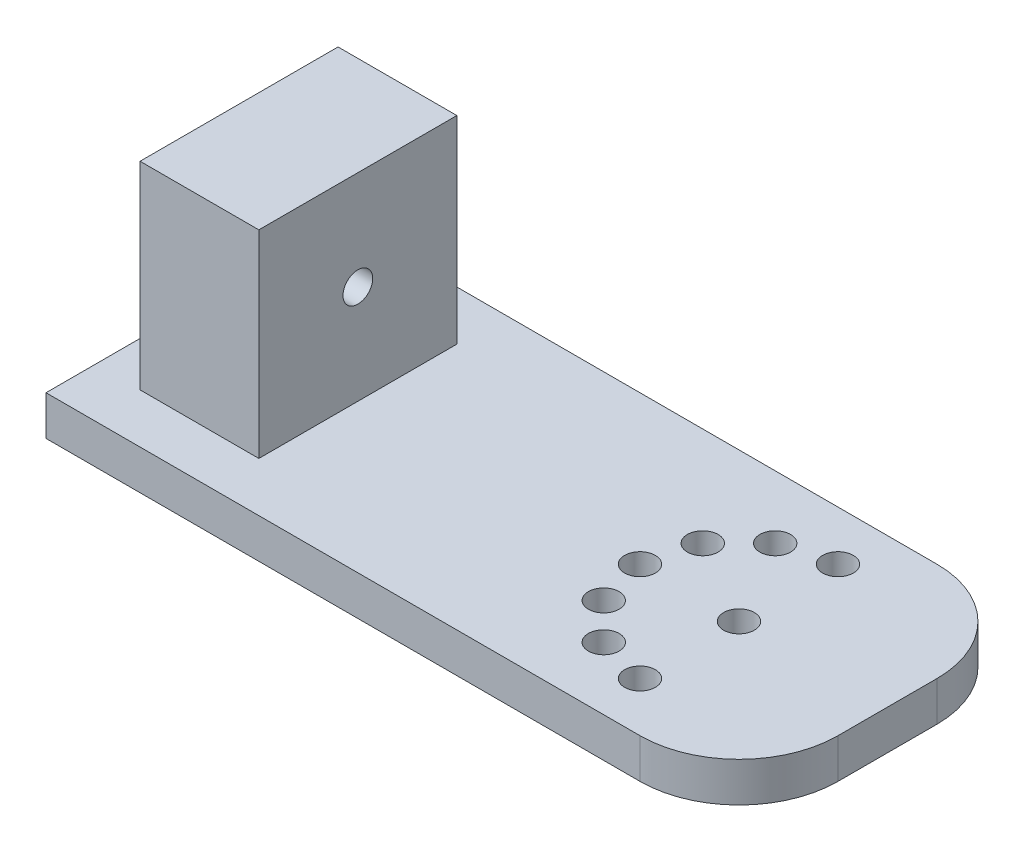
ISO-10303-21;
HEADER;
FILE_DESCRIPTION(('STEP AP214'),'2;1');
FILE_NAME('part.step','',(''),(''),'','','');
FILE_SCHEMA(('AUTOMOTIVE_DESIGN { 1 0 10303 214 1 1 1 1 }'));
ENDSEC;
DATA;
#1=APPLICATION_CONTEXT('core data for automotive mechanical design processes');
#2=APPLICATION_PROTOCOL_DEFINITION('international standard','automotive_design',2000,#1);
#3=PRODUCT_CONTEXT('',#1,'mechanical');
#4=PRODUCT('Part','Part','',(#3));
#5=PRODUCT_RELATED_PRODUCT_CATEGORY('part','',(#4));
#6=PRODUCT_DEFINITION_FORMATION('','',#4);
#7=PRODUCT_DEFINITION_CONTEXT('part definition',#1,'design');
#8=PRODUCT_DEFINITION('design','',#6,#7);
#9=PRODUCT_DEFINITION_SHAPE('','',#8);
#10=(LENGTH_UNIT() NAMED_UNIT(*) SI_UNIT(.MILLI.,.METRE.));
#11=(NAMED_UNIT(*) PLANE_ANGLE_UNIT() SI_UNIT($,.RADIAN.));
#12=(NAMED_UNIT(*) SI_UNIT($,.STERADIAN.) SOLID_ANGLE_UNIT());
#13=UNCERTAINTY_MEASURE_WITH_UNIT(LENGTH_MEASURE(1.E-05),#10,'distance_accuracy_value','');
#14=(GEOMETRIC_REPRESENTATION_CONTEXT(3) GLOBAL_UNCERTAINTY_ASSIGNED_CONTEXT((#13)) GLOBAL_UNIT_ASSIGNED_CONTEXT((#10,
#11,#12)) REPRESENTATION_CONTEXT('',''));
#15=CARTESIAN_POINT('',(0.,0.,0.));
#16=DIRECTION('',(0.,0.,1.));
#17=DIRECTION('',(1.,0.,0.));
#18=AXIS2_PLACEMENT_3D('',#15,#16,#17);
#19=CARTESIAN_POINT('',(60.,4.,10.));
#20=DIRECTION('',(0.,-1.,0.));
#21=DIRECTION('',(0.,0.,-1.));
#22=AXIS2_PLACEMENT_3D('',#19,#20,#21);
#23=CYLINDRICAL_SURFACE('',#22,10.);
#24=DIRECTION('',(0.,-1.,0.));
#25=VECTOR('',#24,1.);
#26=CARTESIAN_POINT('',(60.,4.,0.));
#27=LINE('',#26,#25);
#28=CARTESIAN_POINT('',(60.,4.,0.));
#29=VERTEX_POINT('',#28);
#30=CARTESIAN_POINT('',(60.,0.,0.));
#31=VERTEX_POINT('',#30);
#32=EDGE_CURVE('E202',#29,#31,#27,.T.);
#33=ORIENTED_EDGE('',*,*,#32,.F.);
#34=CARTESIAN_POINT('',(60.,4.,10.));
#35=DIRECTION('',(0.,1.,0.));
#36=DIRECTION('',(0.,0.,1.));
#37=AXIS2_PLACEMENT_3D('',#34,#35,#36);
#38=CIRCLE('',#37,10.);
#39=CARTESIAN_POINT('',(70.,4.,10.));
#40=VERTEX_POINT('',#39);
#41=EDGE_CURVE('E41',#40,#29,#38,.T.);
#42=ORIENTED_EDGE('',*,*,#41,.F.);
#43=DIRECTION('',(0.,-1.,0.));
#44=VECTOR('',#43,1.);
#45=CARTESIAN_POINT('',(70.,4.,10.));
#46=LINE('',#45,#44);
#47=CARTESIAN_POINT('',(70.,0.,10.));
#48=VERTEX_POINT('',#47);
#49=EDGE_CURVE('E205',#48,#40,#46,.F.);
#50=ORIENTED_EDGE('',*,*,#49,.F.);
#51=CARTESIAN_POINT('',(60.,0.,10.));
#52=DIRECTION('',(0.,1.,0.));
#53=DIRECTION('',(0.,0.,1.));
#54=AXIS2_PLACEMENT_3D('',#51,#52,#53);
#55=CIRCLE('',#54,10.);
#56=EDGE_CURVE('E11',#31,#48,#55,.F.);
#57=ORIENTED_EDGE('',*,*,#56,.F.);
#58=EDGE_LOOP('',(#33,#42,#50,#57));
#59=FACE_BOUND('',#58,.T.);
#60=ADVANCED_FACE('F34',(#59),#23,.T.);
#61=CARTESIAN_POINT('',(60.,4.,20.));
#62=DIRECTION('',(0.,1.,0.));
#63=DIRECTION('',(0.,0.,1.));
#64=AXIS2_PLACEMENT_3D('',#61,#62,#63);
#65=CYLINDRICAL_SURFACE('',#64,10.);
#66=DIRECTION('',(0.,1.,0.));
#67=VECTOR('',#66,1.);
#68=CARTESIAN_POINT('',(60.,4.,30.));
#69=LINE('',#68,#67);
#70=CARTESIAN_POINT('',(60.,0.,30.));
#71=VERTEX_POINT('',#70);
#72=CARTESIAN_POINT('',(60.,4.,30.));
#73=VERTEX_POINT('',#72);
#74=EDGE_CURVE('E166',#71,#73,#69,.T.);
#75=ORIENTED_EDGE('',*,*,#74,.F.);
#76=CARTESIAN_POINT('',(60.,0.,20.));
#77=DIRECTION('',(0.,1.,0.));
#78=DIRECTION('',(0.,0.,1.));
#79=AXIS2_PLACEMENT_3D('',#76,#77,#78);
#80=CIRCLE('',#79,10.);
#81=CARTESIAN_POINT('',(70.,0.,20.));
#82=VERTEX_POINT('',#81);
#83=EDGE_CURVE('E198',#82,#71,#80,.F.);
#84=ORIENTED_EDGE('',*,*,#83,.F.);
#85=DIRECTION('',(0.,1.,0.));
#86=VECTOR('',#85,1.);
#87=CARTESIAN_POINT('',(70.,4.,20.));
#88=LINE('',#87,#86);
#89=CARTESIAN_POINT('',(70.,4.,20.));
#90=VERTEX_POINT('',#89);
#91=EDGE_CURVE('E195',#90,#82,#88,.F.);
#92=ORIENTED_EDGE('',*,*,#91,.F.);
#93=CARTESIAN_POINT('',(60.,4.,20.));
#94=DIRECTION('',(0.,1.,0.));
#95=DIRECTION('',(0.,0.,1.));
#96=AXIS2_PLACEMENT_3D('',#93,#94,#95);
#97=CIRCLE('',#96,10.);
#98=EDGE_CURVE('E200',#73,#90,#97,.T.);
#99=ORIENTED_EDGE('',*,*,#98,.F.);
#100=EDGE_LOOP('',(#75,#84,#92,#99));
#101=FACE_BOUND('',#100,.T.);
#102=ADVANCED_FACE('F224',(#101),#65,.T.);
#103=CARTESIAN_POINT('',(0.,4.,0.));
#104=DIRECTION('',(0.,1.,0.));
#105=DIRECTION('',(0.,0.,1.));
#106=AXIS2_PLACEMENT_3D('',#103,#104,#105);
#107=PLANE('',#106);
#108=CARTESIAN_POINT('',(55.,4.,5.));
#109=DIRECTION('',(0.,1.,0.));
#110=DIRECTION('',(0.,0.,1.));
#111=AXIS2_PLACEMENT_3D('',#108,#109,#110);
#112=CIRCLE('',#111,1.55);
#113=CARTESIAN_POINT('',(55.,4.,6.55));
#114=VERTEX_POINT('',#113);
#115=EDGE_CURVE('E431',#114,#114,#112,.T.);
#116=ORIENTED_EDGE('',*,*,#115,.F.);
#117=EDGE_LOOP('',(#116));
#118=FACE_BOUND('',#117,.T.);
#119=CARTESIAN_POINT('',(45.,4.,15.));
#120=DIRECTION('',(0.,1.,0.));
#121=DIRECTION('',(0.,0.,1.));
#122=AXIS2_PLACEMENT_3D('',#119,#120,#121);
#123=CIRCLE('',#122,1.55);
#124=CARTESIAN_POINT('',(45.,4.,16.55));
#125=VERTEX_POINT('',#124);
#126=EDGE_CURVE('E433',#125,#125,#123,.T.);
#127=ORIENTED_EDGE('',*,*,#126,.F.);
#128=EDGE_LOOP('',(#127));
#129=FACE_BOUND('',#128,.T.);
#130=CARTESIAN_POINT('',(55.,4.,25.));
#131=DIRECTION('',(0.,1.,0.));
#132=DIRECTION('',(0.,0.,1.));
#133=AXIS2_PLACEMENT_3D('',#130,#131,#132);
#134=CIRCLE('',#133,1.55);
#135=CARTESIAN_POINT('',(55.,4.,26.55));
#136=VERTEX_POINT('',#135);
#137=EDGE_CURVE('E438',#136,#136,#134,.T.);
#138=ORIENTED_EDGE('',*,*,#137,.F.);
#139=EDGE_LOOP('',(#138));
#140=FACE_BOUND('',#139,.T.);
#141=CARTESIAN_POINT('',(49.9999999999998,4.,23.6602540378443));
#142=DIRECTION('',(0.,1.,0.));
#143=DIRECTION('',(0.,0.,-1.));
#144=AXIS2_PLACEMENT_3D('',#141,#142,#143);
#145=CIRCLE('',#144,1.55000000000001);
#146=CARTESIAN_POINT('',(49.9999999999998,4.,22.1102540378442));
#147=VERTEX_POINT('',#146);
#148=EDGE_CURVE('E446',#147,#147,#145,.T.);
#149=ORIENTED_EDGE('',*,*,#148,.F.);
#150=EDGE_LOOP('',(#149));
#151=FACE_BOUND('',#150,.T.);
#152=CARTESIAN_POINT('',(46.3397459621556,4.,20.));
#153=DIRECTION('',(0.,1.,0.));
#154=DIRECTION('',(0.,0.,-1.));
#155=AXIS2_PLACEMENT_3D('',#152,#153,#154);
#156=CIRCLE('',#155,1.54999999999999);
#157=CARTESIAN_POINT('',(46.3397459621556,4.,18.45));
#158=VERTEX_POINT('',#157);
#159=EDGE_CURVE('E448',#158,#158,#156,.T.);
#160=ORIENTED_EDGE('',*,*,#159,.F.);
#161=EDGE_LOOP('',(#160));
#162=FACE_BOUND('',#161,.T.);
#163=CARTESIAN_POINT('',(46.3397459621556,4.,9.99999999999996));
#164=DIRECTION('',(0.,1.,0.));
#165=DIRECTION('',(0.,0.,-1.));
#166=AXIS2_PLACEMENT_3D('',#163,#164,#165);
#167=CIRCLE('',#166,1.55000000000001);
#168=CARTESIAN_POINT('',(46.3397459621556,4.,8.44999999999996));
#169=VERTEX_POINT('',#168);
#170=EDGE_CURVE('E474',#169,#169,#167,.T.);
#171=ORIENTED_EDGE('',*,*,#170,.F.);
#172=EDGE_LOOP('',(#171));
#173=FACE_BOUND('',#172,.T.);
#174=CARTESIAN_POINT('',(50.0000000000001,4.,6.33974596215558));
#175=DIRECTION('',(0.,1.,0.));
#176=DIRECTION('',(0.,0.,-1.));
#177=AXIS2_PLACEMENT_3D('',#174,#175,#176);
#178=CIRCLE('',#177,1.55);
#179=CARTESIAN_POINT('',(50.0000000000001,4.,4.78974596215558));
#180=VERTEX_POINT('',#179);
#181=EDGE_CURVE('E441',#180,#180,#178,.T.);
#182=ORIENTED_EDGE('',*,*,#181,.F.);
#183=EDGE_LOOP('',(#182));
#184=FACE_BOUND('',#183,.T.);
#185=CARTESIAN_POINT('',(55.,4.,15.));
#186=DIRECTION('',(0.,1.,0.));
#187=DIRECTION('',(0.,0.,1.));
#188=AXIS2_PLACEMENT_3D('',#185,#186,#187);
#189=CIRCLE('',#188,1.55);
#190=CARTESIAN_POINT('',(55.,4.,16.55));
#191=VERTEX_POINT('',#190);
#192=EDGE_CURVE('E171',#191,#191,#189,.T.);
#193=ORIENTED_EDGE('',*,*,#192,.F.);
#194=EDGE_LOOP('',(#193));
#195=FACE_BOUND('',#194,.T.);
#196=DIRECTION('',(0.,0.,-1.));
#197=VECTOR('',#196,1.);
#198=CARTESIAN_POINT('',(70.,4.,0.));
#199=LINE('',#198,#197);
#200=EDGE_CURVE('E149',#90,#40,#199,.T.);
#201=ORIENTED_EDGE('',*,*,#200,.T.);
#202=ORIENTED_EDGE('',*,*,#41,.T.);
#203=DIRECTION('',(-1.,0.,0.));
#204=VECTOR('',#203,1.);
#205=CARTESIAN_POINT('',(0.,4.,0.));
#206=LINE('',#205,#204);
#207=CARTESIAN_POINT('',(0.,4.,0.));
#208=VERTEX_POINT('',#207);
#209=EDGE_CURVE('E152',#29,#208,#206,.T.);
#210=ORIENTED_EDGE('',*,*,#209,.T.);
#211=DIRECTION('',(0.,0.,1.));
#212=VECTOR('',#211,1.);
#213=CARTESIAN_POINT('',(0.,4.,0.));
#214=LINE('',#213,#212);
#215=CARTESIAN_POINT('',(0.,4.,30.));
#216=VERTEX_POINT('',#215);
#217=EDGE_CURVE('E142',#208,#216,#214,.T.);
#218=ORIENTED_EDGE('',*,*,#217,.T.);
#219=DIRECTION('',(1.,0.,0.));
#220=VECTOR('',#219,1.);
#221=CARTESIAN_POINT('',(0.,4.,30.));
#222=LINE('',#221,#220);
#223=EDGE_CURVE('E145',#216,#73,#222,.T.);
#224=ORIENTED_EDGE('',*,*,#223,.T.);
#225=ORIENTED_EDGE('',*,*,#98,.T.);
#226=EDGE_LOOP('',(#201,#202,#210,#218,#224,#225));
#227=FACE_BOUND('',#226,.T.);
#228=DIRECTION('',(1.,0.,0.));
#229=VECTOR('',#228,1.);
#230=CARTESIAN_POINT('',(4.5,4.,25.));
#231=LINE('',#230,#229);
#232=CARTESIAN_POINT('',(4.5,4.,25.));
#233=VERTEX_POINT('',#232);
#234=CARTESIAN_POINT('',(16.5,4.,25.));
#235=VERTEX_POINT('',#234);
#236=EDGE_CURVE('E459',#233,#235,#231,.T.);
#237=ORIENTED_EDGE('',*,*,#236,.F.);
#238=DIRECTION('',(0.,0.,1.));
#239=VECTOR('',#238,1.);
#240=CARTESIAN_POINT('',(4.5,4.,5.));
#241=LINE('',#240,#239);
#242=CARTESIAN_POINT('',(4.5,4.,5.));
#243=VERTEX_POINT('',#242);
#244=EDGE_CURVE('E131',#243,#233,#241,.T.);
#245=ORIENTED_EDGE('',*,*,#244,.F.);
#246=DIRECTION('',(-1.,0.,0.));
#247=VECTOR('',#246,1.);
#248=CARTESIAN_POINT('',(4.5,4.,5.));
#249=LINE('',#248,#247);
#250=CARTESIAN_POINT('',(16.5,4.,5.));
#251=VERTEX_POINT('',#250);
#252=EDGE_CURVE('E127',#251,#243,#249,.T.);
#253=ORIENTED_EDGE('',*,*,#252,.F.);
#254=DIRECTION('',(0.,0.,-1.));
#255=VECTOR('',#254,1.);
#256=CARTESIAN_POINT('',(16.5,4.,5.));
#257=LINE('',#256,#255);
#258=EDGE_CURVE('E461',#235,#251,#257,.T.);
#259=ORIENTED_EDGE('',*,*,#258,.F.);
#260=EDGE_LOOP('',(#237,#245,#253,#259));
#261=FACE_BOUND('',#260,.T.);
#262=ADVANCED_FACE('F207',(#118,#129,#140,#151,#162,#173,#184,#195,#227,#261),#107,.T.);
#263=CARTESIAN_POINT('',(0.,4.,0.));
#264=DIRECTION('',(1.,0.,0.));
#265=DIRECTION('',(0.,0.,-1.));
#266=AXIS2_PLACEMENT_3D('',#263,#264,#265);
#267=PLANE('',#266);
#268=DIRECTION('',(0.,0.,1.));
#269=VECTOR('',#268,1.);
#270=CARTESIAN_POINT('',(0.,0.,0.));
#271=LINE('',#270,#269);
#272=CARTESIAN_POINT('',(0.,0.,0.));
#273=VERTEX_POINT('',#272);
#274=CARTESIAN_POINT('',(0.,0.,30.));
#275=VERTEX_POINT('',#274);
#276=EDGE_CURVE('E133',#273,#275,#271,.T.);
#277=ORIENTED_EDGE('',*,*,#276,.T.);
#278=DIRECTION('',(0.,-1.,0.));
#279=VECTOR('',#278,1.);
#280=CARTESIAN_POINT('',(0.,4.,30.));
#281=LINE('',#280,#279);
#282=EDGE_CURVE('E163',#216,#275,#281,.T.);
#283=ORIENTED_EDGE('',*,*,#282,.F.);
#284=ORIENTED_EDGE('',*,*,#217,.F.);
#285=DIRECTION('',(0.,-1.,0.));
#286=VECTOR('',#285,1.);
#287=CARTESIAN_POINT('',(0.,4.,0.));
#288=LINE('',#287,#286);
#289=EDGE_CURVE('E153',#208,#273,#288,.T.);
#290=ORIENTED_EDGE('',*,*,#289,.T.);
#291=EDGE_LOOP('',(#277,#283,#284,#290));
#292=FACE_BOUND('',#291,.T.);
#293=ADVANCED_FACE('F218',(#292),#267,.F.);
#294=CARTESIAN_POINT('',(0.,4.,30.));
#295=DIRECTION('',(0.,0.,-1.));
#296=DIRECTION('',(-1.,0.,0.));
#297=AXIS2_PLACEMENT_3D('',#294,#295,#296);
#298=PLANE('',#297);
#299=DIRECTION('',(1.,0.,0.));
#300=VECTOR('',#299,1.);
#301=CARTESIAN_POINT('',(0.,0.,30.));
#302=LINE('',#301,#300);
#303=EDGE_CURVE('E136',#275,#71,#302,.T.);
#304=ORIENTED_EDGE('',*,*,#303,.T.);
#305=ORIENTED_EDGE('',*,*,#74,.T.);
#306=ORIENTED_EDGE('',*,*,#223,.F.);
#307=ORIENTED_EDGE('',*,*,#282,.T.);
#308=EDGE_LOOP('',(#304,#305,#306,#307));
#309=FACE_BOUND('',#308,.T.);
#310=ADVANCED_FACE('F221',(#309),#298,.F.);
#311=CARTESIAN_POINT('',(70.,4.,0.));
#312=DIRECTION('',(-1.,0.,0.));
#313=DIRECTION('',(0.,0.,1.));
#314=AXIS2_PLACEMENT_3D('',#311,#312,#313);
#315=PLANE('',#314);
#316=DIRECTION('',(0.,0.,-1.));
#317=VECTOR('',#316,1.);
#318=CARTESIAN_POINT('',(70.,0.,0.));
#319=LINE('',#318,#317);
#320=EDGE_CURVE('E157',#82,#48,#319,.T.);
#321=ORIENTED_EDGE('',*,*,#320,.T.);
#322=ORIENTED_EDGE('',*,*,#49,.T.);
#323=ORIENTED_EDGE('',*,*,#200,.F.);
#324=ORIENTED_EDGE('',*,*,#91,.T.);
#325=EDGE_LOOP('',(#321,#322,#323,#324));
#326=FACE_BOUND('',#325,.T.);
#327=ADVANCED_FACE('F226',(#326),#315,.F.);
#328=CARTESIAN_POINT('',(0.,4.,0.));
#329=DIRECTION('',(0.,0.,1.));
#330=DIRECTION('',(1.,0.,0.));
#331=AXIS2_PLACEMENT_3D('',#328,#329,#330);
#332=PLANE('',#331);
#333=ORIENTED_EDGE('',*,*,#209,.F.);
#334=ORIENTED_EDGE('',*,*,#32,.T.);
#335=DIRECTION('',(-1.,0.,0.));
#336=VECTOR('',#335,1.);
#337=CARTESIAN_POINT('',(0.,0.,0.));
#338=LINE('',#337,#336);
#339=EDGE_CURVE('E146',#31,#273,#338,.T.);
#340=ORIENTED_EDGE('',*,*,#339,.T.);
#341=ORIENTED_EDGE('',*,*,#289,.F.);
#342=EDGE_LOOP('',(#333,#334,#340,#341));
#343=FACE_BOUND('',#342,.T.);
#344=ADVANCED_FACE('F213',(#343),#332,.F.);
#345=CARTESIAN_POINT('',(0.,0.,0.));
#346=DIRECTION('',(0.,1.,0.));
#347=DIRECTION('',(0.,0.,1.));
#348=AXIS2_PLACEMENT_3D('',#345,#346,#347);
#349=PLANE('',#348);
#350=CARTESIAN_POINT('',(55.,0.,5.));
#351=DIRECTION('',(0.,1.,0.));
#352=DIRECTION('',(0.,0.,1.));
#353=AXIS2_PLACEMENT_3D('',#350,#351,#352);
#354=CIRCLE('',#353,1.55);
#355=CARTESIAN_POINT('',(55.,0.,6.55));
#356=VERTEX_POINT('',#355);
#357=EDGE_CURVE('E189',#356,#356,#354,.T.);
#358=ORIENTED_EDGE('',*,*,#357,.T.);
#359=EDGE_LOOP('',(#358));
#360=FACE_BOUND('',#359,.T.);
#361=CARTESIAN_POINT('',(45.,0.,15.));
#362=DIRECTION('',(0.,1.,0.));
#363=DIRECTION('',(0.,0.,1.));
#364=AXIS2_PLACEMENT_3D('',#361,#362,#363);
#365=CIRCLE('',#364,1.55);
#366=CARTESIAN_POINT('',(45.,0.,16.55));
#367=VERTEX_POINT('',#366);
#368=EDGE_CURVE('E186',#367,#367,#365,.T.);
#369=ORIENTED_EDGE('',*,*,#368,.T.);
#370=EDGE_LOOP('',(#369));
#371=FACE_BOUND('',#370,.T.);
#372=CARTESIAN_POINT('',(55.,0.,25.));
#373=DIRECTION('',(0.,1.,0.));
#374=DIRECTION('',(0.,0.,1.));
#375=AXIS2_PLACEMENT_3D('',#372,#373,#374);
#376=CIRCLE('',#375,1.55);
#377=CARTESIAN_POINT('',(55.,0.,26.55));
#378=VERTEX_POINT('',#377);
#379=EDGE_CURVE('E183',#378,#378,#376,.T.);
#380=ORIENTED_EDGE('',*,*,#379,.T.);
#381=EDGE_LOOP('',(#380));
#382=FACE_BOUND('',#381,.T.);
#383=CARTESIAN_POINT('',(49.9999999999998,0.,23.6602540378443));
#384=DIRECTION('',(0.,1.,0.));
#385=DIRECTION('',(0.,0.,1.));
#386=AXIS2_PLACEMENT_3D('',#383,#384,#385);
#387=CIRCLE('',#386,1.55000000000001);
#388=CARTESIAN_POINT('',(49.9999999999998,0.,25.2102540378443));
#389=VERTEX_POINT('',#388);
#390=EDGE_CURVE('E180',#389,#389,#387,.T.);
#391=ORIENTED_EDGE('',*,*,#390,.T.);
#392=EDGE_LOOP('',(#391));
#393=FACE_BOUND('',#392,.T.);
#394=CARTESIAN_POINT('',(46.3397459621556,0.,20.));
#395=DIRECTION('',(0.,1.,0.));
#396=DIRECTION('',(0.,0.,1.));
#397=AXIS2_PLACEMENT_3D('',#394,#395,#396);
#398=CIRCLE('',#397,1.54999999999999);
#399=CARTESIAN_POINT('',(46.3397459621556,0.,21.55));
#400=VERTEX_POINT('',#399);
#401=EDGE_CURVE('E177',#400,#400,#398,.T.);
#402=ORIENTED_EDGE('',*,*,#401,.T.);
#403=EDGE_LOOP('',(#402));
#404=FACE_BOUND('',#403,.T.);
#405=CARTESIAN_POINT('',(46.3397459621556,0.,9.99999999999996));
#406=DIRECTION('',(0.,1.,0.));
#407=DIRECTION('',(0.,0.,1.));
#408=AXIS2_PLACEMENT_3D('',#405,#406,#407);
#409=CIRCLE('',#408,1.55000000000001);
#410=CARTESIAN_POINT('',(46.3397459621556,0.,11.55));
#411=VERTEX_POINT('',#410);
#412=EDGE_CURVE('E174',#411,#411,#409,.T.);
#413=ORIENTED_EDGE('',*,*,#412,.T.);
#414=EDGE_LOOP('',(#413));
#415=FACE_BOUND('',#414,.T.);
#416=CARTESIAN_POINT('',(50.0000000000001,0.,6.33974596215558));
#417=DIRECTION('',(0.,1.,0.));
#418=DIRECTION('',(0.,0.,1.));
#419=AXIS2_PLACEMENT_3D('',#416,#417,#418);
#420=CIRCLE('',#419,1.55);
#421=CARTESIAN_POINT('',(50.0000000000001,0.,7.88974596215558));
#422=VERTEX_POINT('',#421);
#423=EDGE_CURVE('E170',#422,#422,#420,.T.);
#424=ORIENTED_EDGE('',*,*,#423,.T.);
#425=EDGE_LOOP('',(#424));
#426=FACE_BOUND('',#425,.T.);
#427=CARTESIAN_POINT('',(55.,0.,15.));
#428=DIRECTION('',(0.,1.,0.));
#429=DIRECTION('',(0.,0.,1.));
#430=AXIS2_PLACEMENT_3D('',#427,#428,#429);
#431=CIRCLE('',#430,1.55);
#432=CARTESIAN_POINT('',(55.,0.,16.55));
#433=VERTEX_POINT('',#432);
#434=EDGE_CURVE('E167',#433,#433,#431,.T.);
#435=ORIENTED_EDGE('',*,*,#434,.T.);
#436=EDGE_LOOP('',(#435));
#437=FACE_BOUND('',#436,.T.);
#438=ORIENTED_EDGE('',*,*,#339,.F.);
#439=ORIENTED_EDGE('',*,*,#56,.T.);
#440=ORIENTED_EDGE('',*,*,#320,.F.);
#441=ORIENTED_EDGE('',*,*,#83,.T.);
#442=ORIENTED_EDGE('',*,*,#303,.F.);
#443=ORIENTED_EDGE('',*,*,#276,.F.);
#444=EDGE_LOOP('',(#438,#439,#440,#441,#442,#443));
#445=FACE_BOUND('',#444,.T.);
#446=ADVANCED_FACE('F227',(#360,#371,#382,#393,#404,#415,#426,#437,#445),#349,.F.);
#447=CARTESIAN_POINT('',(4.5,24.,5.));
#448=DIRECTION('',(1.,0.,0.));
#449=DIRECTION('',(0.,0.,-1.));
#450=AXIS2_PLACEMENT_3D('',#447,#448,#449);
#451=PLANE('',#450);
#452=CARTESIAN_POINT('',(4.5,14.,15.));
#453=DIRECTION('',(1.,0.,0.));
#454=DIRECTION('',(0.,0.,-1.));
#455=AXIS2_PLACEMENT_3D('',#452,#453,#454);
#456=CIRCLE('',#455,1.5);
#457=CARTESIAN_POINT('',(4.5,14.,13.5));
#458=VERTEX_POINT('',#457);
#459=EDGE_CURVE('E450',#458,#458,#456,.T.);
#460=ORIENTED_EDGE('',*,*,#459,.T.);
#461=EDGE_LOOP('',(#460));
#462=FACE_BOUND('',#461,.T.);
#463=ORIENTED_EDGE('',*,*,#244,.T.);
#464=DIRECTION('',(0.,-1.,0.));
#465=VECTOR('',#464,1.);
#466=CARTESIAN_POINT('',(4.5,24.,25.));
#467=LINE('',#466,#465);
#468=CARTESIAN_POINT('',(4.5,24.,25.));
#469=VERTEX_POINT('',#468);
#470=EDGE_CURVE('E111',#469,#233,#467,.T.);
#471=ORIENTED_EDGE('',*,*,#470,.F.);
#472=DIRECTION('',(0.,0.,1.));
#473=VECTOR('',#472,1.);
#474=CARTESIAN_POINT('',(4.5,24.,5.));
#475=LINE('',#474,#473);
#476=CARTESIAN_POINT('',(4.5,24.,5.));
#477=VERTEX_POINT('',#476);
#478=EDGE_CURVE('E118',#477,#469,#475,.T.);
#479=ORIENTED_EDGE('',*,*,#478,.F.);
#480=DIRECTION('',(0.,-1.,0.));
#481=VECTOR('',#480,1.);
#482=CARTESIAN_POINT('',(4.5,24.,5.));
#483=LINE('',#482,#481);
#484=EDGE_CURVE('E457',#477,#243,#483,.T.);
#485=ORIENTED_EDGE('',*,*,#484,.T.);
#486=EDGE_LOOP('',(#463,#471,#479,#485));
#487=FACE_BOUND('',#486,.T.);
#488=ADVANCED_FACE('F129',(#462,#487),#451,.F.);
#489=CARTESIAN_POINT('',(4.5,24.,25.));
#490=DIRECTION('',(0.,0.,-1.));
#491=DIRECTION('',(-1.,0.,0.));
#492=AXIS2_PLACEMENT_3D('',#489,#490,#491);
#493=PLANE('',#492);
#494=ORIENTED_EDGE('',*,*,#236,.T.);
#495=DIRECTION('',(0.,-1.,0.));
#496=VECTOR('',#495,1.);
#497=CARTESIAN_POINT('',(16.5,24.,25.));
#498=LINE('',#497,#496);
#499=CARTESIAN_POINT('',(16.5,24.,25.));
#500=VERTEX_POINT('',#499);
#501=EDGE_CURVE('E114',#500,#235,#498,.T.);
#502=ORIENTED_EDGE('',*,*,#501,.F.);
#503=DIRECTION('',(1.,0.,0.));
#504=VECTOR('',#503,1.);
#505=CARTESIAN_POINT('',(4.5,24.,25.));
#506=LINE('',#505,#504);
#507=EDGE_CURVE('E107',#469,#500,#506,.T.);
#508=ORIENTED_EDGE('',*,*,#507,.F.);
#509=ORIENTED_EDGE('',*,*,#470,.T.);
#510=EDGE_LOOP('',(#494,#502,#508,#509));
#511=FACE_BOUND('',#510,.T.);
#512=ADVANCED_FACE('F109',(#511),#493,.F.);
#513=CARTESIAN_POINT('',(16.5,24.,5.));
#514=DIRECTION('',(-1.,0.,0.));
#515=DIRECTION('',(0.,0.,1.));
#516=AXIS2_PLACEMENT_3D('',#513,#514,#515);
#517=PLANE('',#516);
#518=CARTESIAN_POINT('',(16.5,14.,15.));
#519=DIRECTION('',(1.,0.,0.));
#520=DIRECTION('',(0.,0.,-1.));
#521=AXIS2_PLACEMENT_3D('',#518,#519,#520);
#522=CIRCLE('',#521,1.5);
#523=CARTESIAN_POINT('',(16.5,14.,13.5));
#524=VERTEX_POINT('',#523);
#525=EDGE_CURVE('E192',#524,#524,#522,.T.);
#526=ORIENTED_EDGE('',*,*,#525,.F.);
#527=EDGE_LOOP('',(#526));
#528=FACE_BOUND('',#527,.T.);
#529=ORIENTED_EDGE('',*,*,#258,.T.);
#530=DIRECTION('',(0.,-1.,0.));
#531=VECTOR('',#530,1.);
#532=CARTESIAN_POINT('',(16.5,24.,5.));
#533=LINE('',#532,#531);
#534=CARTESIAN_POINT('',(16.5,24.,5.));
#535=VERTEX_POINT('',#534);
#536=EDGE_CURVE('E138',#535,#251,#533,.T.);
#537=ORIENTED_EDGE('',*,*,#536,.F.);
#538=DIRECTION('',(0.,0.,-1.));
#539=VECTOR('',#538,1.);
#540=CARTESIAN_POINT('',(16.5,24.,5.));
#541=LINE('',#540,#539);
#542=EDGE_CURVE('E117',#500,#535,#541,.T.);
#543=ORIENTED_EDGE('',*,*,#542,.F.);
#544=ORIENTED_EDGE('',*,*,#501,.T.);
#545=EDGE_LOOP('',(#529,#537,#543,#544));
#546=FACE_BOUND('',#545,.T.);
#547=ADVANCED_FACE('F288',(#528,#546),#517,.F.);
#548=CARTESIAN_POINT('',(4.5,24.,5.));
#549=DIRECTION('',(0.,0.,1.));
#550=DIRECTION('',(1.,0.,0.));
#551=AXIS2_PLACEMENT_3D('',#548,#549,#550);
#552=PLANE('',#551);
#553=ORIENTED_EDGE('',*,*,#252,.T.);
#554=ORIENTED_EDGE('',*,*,#484,.F.);
#555=DIRECTION('',(-1.,0.,0.));
#556=VECTOR('',#555,1.);
#557=CARTESIAN_POINT('',(4.5,24.,5.));
#558=LINE('',#557,#556);
#559=EDGE_CURVE('E123',#535,#477,#558,.T.);
#560=ORIENTED_EDGE('',*,*,#559,.F.);
#561=ORIENTED_EDGE('',*,*,#536,.T.);
#562=EDGE_LOOP('',(#553,#554,#560,#561));
#563=FACE_BOUND('',#562,.T.);
#564=ADVANCED_FACE('F297',(#563),#552,.F.);
#565=CARTESIAN_POINT('',(0.,24.,0.));
#566=DIRECTION('',(0.,1.,0.));
#567=DIRECTION('',(0.,0.,1.));
#568=AXIS2_PLACEMENT_3D('',#565,#566,#567);
#569=PLANE('',#568);
#570=ORIENTED_EDGE('',*,*,#478,.T.);
#571=ORIENTED_EDGE('',*,*,#507,.T.);
#572=ORIENTED_EDGE('',*,*,#542,.T.);
#573=ORIENTED_EDGE('',*,*,#559,.T.);
#574=EDGE_LOOP('',(#570,#571,#572,#573));
#575=FACE_BOUND('',#574,.T.);
#576=ADVANCED_FACE('F121',(#575),#569,.T.);
#577=CARTESIAN_POINT('',(4.5,14.,15.));
#578=DIRECTION('',(1.,0.,0.));
#579=DIRECTION('',(0.,0.,-1.));
#580=AXIS2_PLACEMENT_3D('',#577,#578,#579);
#581=CYLINDRICAL_SURFACE('',#580,1.5);
#582=ORIENTED_EDGE('',*,*,#459,.F.);
#583=EDGE_LOOP('',(#582));
#584=FACE_BOUND('',#583,.T.);
#585=ORIENTED_EDGE('',*,*,#525,.T.);
#586=EDGE_LOOP('',(#585));
#587=FACE_BOUND('',#586,.T.);
#588=ADVANCED_FACE('F313',(#584,#587),#581,.F.);
#589=CARTESIAN_POINT('',(55.,-46.,15.));
#590=DIRECTION('',(0.,1.,0.));
#591=DIRECTION('',(0.,0.,1.));
#592=AXIS2_PLACEMENT_3D('',#589,#590,#591);
#593=CYLINDRICAL_SURFACE('',#592,1.55);
#594=ORIENTED_EDGE('',*,*,#192,.T.);
#595=EDGE_LOOP('',(#594));
#596=FACE_BOUND('',#595,.T.);
#597=ORIENTED_EDGE('',*,*,#434,.F.);
#598=EDGE_LOOP('',(#597));
#599=FACE_BOUND('',#598,.T.);
#600=ADVANCED_FACE('F320',(#596,#599),#593,.F.);
#601=CARTESIAN_POINT('',(50.0000000000001,-46.,6.33974596215558));
#602=DIRECTION('',(0.,1.,0.));
#603=DIRECTION('',(0.,0.,1.));
#604=AXIS2_PLACEMENT_3D('',#601,#602,#603);
#605=CYLINDRICAL_SURFACE('',#604,1.55);
#606=ORIENTED_EDGE('',*,*,#181,.T.);
#607=EDGE_LOOP('',(#606));
#608=FACE_BOUND('',#607,.T.);
#609=ORIENTED_EDGE('',*,*,#423,.F.);
#610=EDGE_LOOP('',(#609));
#611=FACE_BOUND('',#610,.T.);
#612=ADVANCED_FACE('F329',(#608,#611),#605,.F.);
#613=CARTESIAN_POINT('',(46.3397459621556,-46.,9.99999999999996));
#614=DIRECTION('',(0.,1.,0.));
#615=DIRECTION('',(0.,0.,1.));
#616=AXIS2_PLACEMENT_3D('',#613,#614,#615);
#617=CYLINDRICAL_SURFACE('',#616,1.55000000000001);
#618=ORIENTED_EDGE('',*,*,#170,.T.);
#619=EDGE_LOOP('',(#618));
#620=FACE_BOUND('',#619,.T.);
#621=ORIENTED_EDGE('',*,*,#412,.F.);
#622=EDGE_LOOP('',(#621));
#623=FACE_BOUND('',#622,.T.);
#624=ADVANCED_FACE('F338',(#620,#623),#617,.F.);
#625=CARTESIAN_POINT('',(46.3397459621556,-46.,20.));
#626=DIRECTION('',(0.,1.,0.));
#627=DIRECTION('',(0.,0.,1.));
#628=AXIS2_PLACEMENT_3D('',#625,#626,#627);
#629=CYLINDRICAL_SURFACE('',#628,1.54999999999999);
#630=ORIENTED_EDGE('',*,*,#159,.T.);
#631=EDGE_LOOP('',(#630));
#632=FACE_BOUND('',#631,.T.);
#633=ORIENTED_EDGE('',*,*,#401,.F.);
#634=EDGE_LOOP('',(#633));
#635=FACE_BOUND('',#634,.T.);
#636=ADVANCED_FACE('F347',(#632,#635),#629,.F.);
#637=CARTESIAN_POINT('',(49.9999999999998,-46.,23.6602540378443));
#638=DIRECTION('',(0.,1.,0.));
#639=DIRECTION('',(0.,0.,1.));
#640=AXIS2_PLACEMENT_3D('',#637,#638,#639);
#641=CYLINDRICAL_SURFACE('',#640,1.55000000000001);
#642=ORIENTED_EDGE('',*,*,#148,.T.);
#643=EDGE_LOOP('',(#642));
#644=FACE_BOUND('',#643,.T.);
#645=ORIENTED_EDGE('',*,*,#390,.F.);
#646=EDGE_LOOP('',(#645));
#647=FACE_BOUND('',#646,.T.);
#648=ADVANCED_FACE('F356',(#644,#647),#641,.F.);
#649=CARTESIAN_POINT('',(55.,-46.,25.));
#650=DIRECTION('',(0.,1.,0.));
#651=DIRECTION('',(0.,0.,1.));
#652=AXIS2_PLACEMENT_3D('',#649,#650,#651);
#653=CYLINDRICAL_SURFACE('',#652,1.55);
#654=ORIENTED_EDGE('',*,*,#137,.T.);
#655=EDGE_LOOP('',(#654));
#656=FACE_BOUND('',#655,.T.);
#657=ORIENTED_EDGE('',*,*,#379,.F.);
#658=EDGE_LOOP('',(#657));
#659=FACE_BOUND('',#658,.T.);
#660=ADVANCED_FACE('F365',(#656,#659),#653,.F.);
#661=CARTESIAN_POINT('',(45.,-46.,15.));
#662=DIRECTION('',(0.,1.,0.));
#663=DIRECTION('',(0.,0.,1.));
#664=AXIS2_PLACEMENT_3D('',#661,#662,#663);
#665=CYLINDRICAL_SURFACE('',#664,1.55);
#666=ORIENTED_EDGE('',*,*,#126,.T.);
#667=EDGE_LOOP('',(#666));
#668=FACE_BOUND('',#667,.T.);
#669=ORIENTED_EDGE('',*,*,#368,.F.);
#670=EDGE_LOOP('',(#669));
#671=FACE_BOUND('',#670,.T.);
#672=ADVANCED_FACE('F374',(#668,#671),#665,.F.);
#673=CARTESIAN_POINT('',(55.,-46.,5.));
#674=DIRECTION('',(0.,1.,0.));
#675=DIRECTION('',(0.,0.,1.));
#676=AXIS2_PLACEMENT_3D('',#673,#674,#675);
#677=CYLINDRICAL_SURFACE('',#676,1.55);
#678=ORIENTED_EDGE('',*,*,#115,.T.);
#679=EDGE_LOOP('',(#678));
#680=FACE_BOUND('',#679,.T.);
#681=ORIENTED_EDGE('',*,*,#357,.F.);
#682=EDGE_LOOP('',(#681));
#683=FACE_BOUND('',#682,.T.);
#684=ADVANCED_FACE('F383',(#680,#683),#677,.F.);
#685=CLOSED_SHELL('',(#60,#102,#262,#293,#310,#327,#344,#446,#488,#512,#547,#564,#576,#588,#600,
#612,#624,#636,#648,#660,#672,#684));
#686=MANIFOLD_SOLID_BREP('B2',#685);
#687=ADVANCED_BREP_SHAPE_REPRESENTATION('',(#18,#686),#14);
#688=SHAPE_DEFINITION_REPRESENTATION(#9,#687);
ENDSEC;
END-ISO-10303-21;
